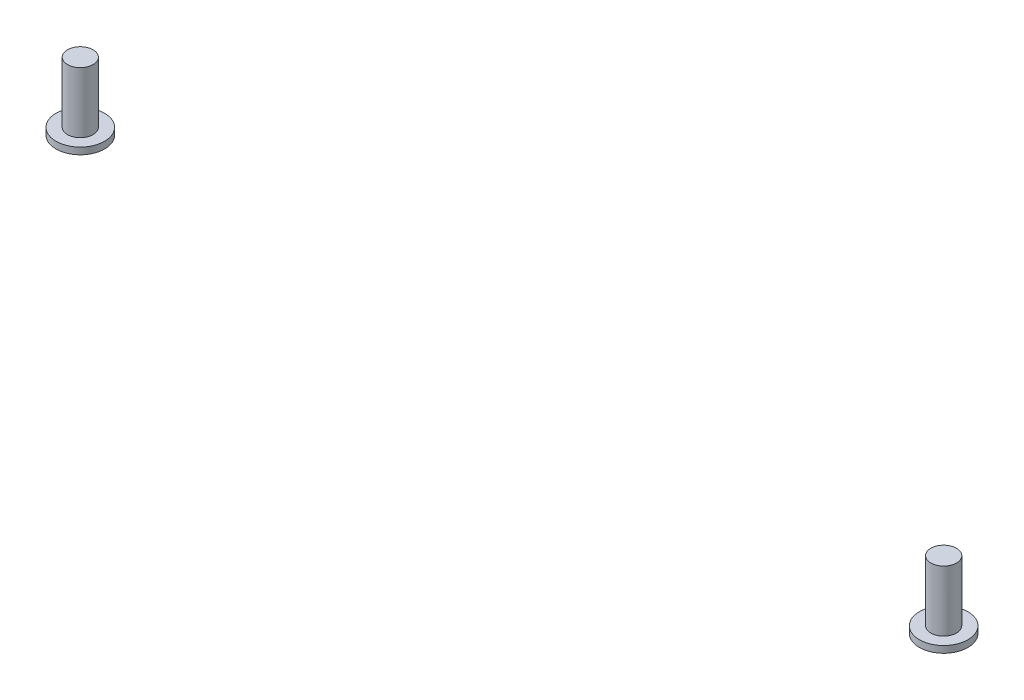
ISO-10303-21;
HEADER;
FILE_DESCRIPTION(('STEP AP214'),'2;1');
FILE_NAME('part.step','',(''),(''),'','','');
FILE_SCHEMA(('AUTOMOTIVE_DESIGN { 1 0 10303 214 1 1 1 1 }'));
ENDSEC;
DATA;
#1=APPLICATION_CONTEXT('core data for automotive mechanical design processes');
#2=APPLICATION_PROTOCOL_DEFINITION('international standard','automotive_design',2000,#1);
#3=PRODUCT_CONTEXT('',#1,'mechanical');
#4=PRODUCT('Part','Part','',(#3));
#5=PRODUCT_RELATED_PRODUCT_CATEGORY('part','',(#4));
#6=PRODUCT_DEFINITION_FORMATION('','',#4);
#7=PRODUCT_DEFINITION_CONTEXT('part definition',#1,'design');
#8=PRODUCT_DEFINITION('design','',#6,#7);
#9=PRODUCT_DEFINITION_SHAPE('','',#8);
#10=(LENGTH_UNIT() NAMED_UNIT(*) SI_UNIT(.MILLI.,.METRE.));
#11=(NAMED_UNIT(*) PLANE_ANGLE_UNIT() SI_UNIT($,.RADIAN.));
#12=(NAMED_UNIT(*) SI_UNIT($,.STERADIAN.) SOLID_ANGLE_UNIT());
#13=UNCERTAINTY_MEASURE_WITH_UNIT(LENGTH_MEASURE(1.E-05),#10,'distance_accuracy_value','');
#14=(GEOMETRIC_REPRESENTATION_CONTEXT(3) GLOBAL_UNCERTAINTY_ASSIGNED_CONTEXT((#13)) GLOBAL_UNIT_ASSIGNED_CONTEXT((#10,
#11,#12)) REPRESENTATION_CONTEXT('',''));
#15=CARTESIAN_POINT('',(0.,0.,0.));
#16=DIRECTION('',(0.,0.,1.));
#17=DIRECTION('',(1.,0.,0.));
#18=AXIS2_PLACEMENT_3D('',#15,#16,#17);
#19=CARTESIAN_POINT('',(-60.,213.,45.));
#20=DIRECTION('',(0.,1.,0.));
#21=DIRECTION('',(0.,0.,1.));
#22=AXIS2_PLACEMENT_3D('',#19,#20,#21);
#23=PLANE('',#22);
#24=CARTESIAN_POINT('',(-60.,213.,45.));
#25=DIRECTION('',(0.,-1.,0.));
#26=DIRECTION('',(0.,0.,-1.));
#27=AXIS2_PLACEMENT_3D('',#24,#25,#26);
#28=CIRCLE('',#27,1.9);
#29=CARTESIAN_POINT('',(-60.,213.,43.1));
#30=VERTEX_POINT('',#29);
#31=EDGE_CURVE('P0_E23',#30,#30,#28,.T.);
#32=ORIENTED_EDGE('',*,*,#31,.F.);
#33=EDGE_LOOP('',(#32));
#34=FACE_BOUND('',#33,.T.);
#35=ADVANCED_FACE('P0_F15',(#34),#23,.T.);
#36=CARTESIAN_POINT('',(-60.,203.95,45.));
#37=DIRECTION('',(0.,1.,0.));
#38=DIRECTION('',(0.,0.,1.));
#39=AXIS2_PLACEMENT_3D('',#36,#37,#38);
#40=CYLINDRICAL_SURFACE('',#39,1.9);
#41=CARTESIAN_POINT('',(-60.,204.,45.));
#42=DIRECTION('',(0.,1.,0.));
#43=DIRECTION('',(0.,0.,1.));
#44=AXIS2_PLACEMENT_3D('',#41,#42,#43);
#45=CIRCLE('',#44,1.9);
#46=CARTESIAN_POINT('',(-60.,204.,46.9));
#47=VERTEX_POINT('',#46);
#48=EDGE_CURVE('P0_E10',#47,#47,#45,.F.);
#49=ORIENTED_EDGE('',*,*,#48,.F.);
#50=EDGE_LOOP('',(#49));
#51=FACE_BOUND('',#50,.T.);
#52=ORIENTED_EDGE('',*,*,#31,.T.);
#53=EDGE_LOOP('',(#52));
#54=FACE_BOUND('',#53,.T.);
#55=ADVANCED_FACE('P0_F17',(#51,#54),#40,.T.);
#56=CARTESIAN_POINT('',(-60.,204.,45.));
#57=DIRECTION('',(0.,1.,0.));
#58=DIRECTION('',(0.,0.,1.));
#59=AXIS2_PLACEMENT_3D('',#56,#57,#58);
#60=PLANE('',#59);
#61=ORIENTED_EDGE('',*,*,#48,.T.);
#62=EDGE_LOOP('',(#61));
#63=FACE_BOUND('',#62,.T.);
#64=CARTESIAN_POINT('',(-60.,204.,45.));
#65=DIRECTION('',(0.,-1.,0.));
#66=DIRECTION('',(0.,0.,-1.));
#67=AXIS2_PLACEMENT_3D('',#64,#65,#66);
#68=CIRCLE('',#67,3.6);
#69=CARTESIAN_POINT('',(-60.,204.,41.4));
#70=VERTEX_POINT('',#69);
#71=EDGE_CURVE('P0_E31',#70,#70,#68,.T.);
#72=ORIENTED_EDGE('',*,*,#71,.F.);
#73=EDGE_LOOP('',(#72));
#74=FACE_BOUND('',#73,.T.);
#75=ADVANCED_FACE('P0_F45',(#63,#74),#60,.T.);
#76=CARTESIAN_POINT('',(-60.,203.,45.));
#77=DIRECTION('',(0.,-1.,0.));
#78=DIRECTION('',(0.,0.,-1.));
#79=AXIS2_PLACEMENT_3D('',#76,#77,#78);
#80=PLANE('',#79);
#81=CARTESIAN_POINT('',(-60.,203.,45.));
#82=DIRECTION('',(0.,1.,0.));
#83=DIRECTION('',(0.,0.,1.));
#84=AXIS2_PLACEMENT_3D('',#81,#82,#83);
#85=CIRCLE('',#84,3.6);
#86=CARTESIAN_POINT('',(-60.,203.,48.6));
#87=VERTEX_POINT('',#86);
#88=EDGE_CURVE('P0_E35',#87,#87,#85,.T.);
#89=ORIENTED_EDGE('',*,*,#88,.F.);
#90=EDGE_LOOP('',(#89));
#91=FACE_BOUND('',#90,.T.);
#92=ADVANCED_FACE('P0_F43',(#91),#80,.T.);
#93=CARTESIAN_POINT('',(-60.,203.,45.));
#94=DIRECTION('',(0.,1.,0.));
#95=DIRECTION('',(0.,0.,1.));
#96=AXIS2_PLACEMENT_3D('',#93,#94,#95);
#97=CYLINDRICAL_SURFACE('',#96,3.6);
#98=ORIENTED_EDGE('',*,*,#71,.T.);
#99=EDGE_LOOP('',(#98));
#100=FACE_BOUND('',#99,.T.);
#101=ORIENTED_EDGE('',*,*,#88,.T.);
#102=EDGE_LOOP('',(#101));
#103=FACE_BOUND('',#102,.T.);
#104=ADVANCED_FACE('P0_F41',(#100,#103),#97,.T.);
#105=CLOSED_SHELL('',(#35,#55,#75,#92,#104));
#106=MANIFOLD_SOLID_BREP('P0_B1',#105);
#107=CARTESIAN_POINT('',(68.,213.,45.));
#108=DIRECTION('',(0.,1.,0.));
#109=DIRECTION('',(0.,0.,1.));
#110=AXIS2_PLACEMENT_3D('',#107,#108,#109);
#111=PLANE('',#110);
#112=CARTESIAN_POINT('',(68.,213.,45.));
#113=DIRECTION('',(0.,-1.,0.));
#114=DIRECTION('',(0.,0.,-1.));
#115=AXIS2_PLACEMENT_3D('',#112,#113,#114);
#116=CIRCLE('',#115,1.9);
#117=CARTESIAN_POINT('',(68.,213.,43.1));
#118=VERTEX_POINT('',#117);
#119=EDGE_CURVE('P1_E23',#118,#118,#116,.T.);
#120=ORIENTED_EDGE('',*,*,#119,.F.);
#121=EDGE_LOOP('',(#120));
#122=FACE_BOUND('',#121,.T.);
#123=ADVANCED_FACE('P1_F15',(#122),#111,.T.);
#124=CARTESIAN_POINT('',(68.,203.95,45.));
#125=DIRECTION('',(0.,1.,0.));
#126=DIRECTION('',(0.,0.,1.));
#127=AXIS2_PLACEMENT_3D('',#124,#125,#126);
#128=CYLINDRICAL_SURFACE('',#127,1.9);
#129=CARTESIAN_POINT('',(68.,204.,45.));
#130=DIRECTION('',(0.,1.,0.));
#131=DIRECTION('',(0.,0.,1.));
#132=AXIS2_PLACEMENT_3D('',#129,#130,#131);
#133=CIRCLE('',#132,1.9);
#134=CARTESIAN_POINT('',(68.,204.,46.9));
#135=VERTEX_POINT('',#134);
#136=EDGE_CURVE('P1_E10',#135,#135,#133,.F.);
#137=ORIENTED_EDGE('',*,*,#136,.F.);
#138=EDGE_LOOP('',(#137));
#139=FACE_BOUND('',#138,.T.);
#140=ORIENTED_EDGE('',*,*,#119,.T.);
#141=EDGE_LOOP('',(#140));
#142=FACE_BOUND('',#141,.T.);
#143=ADVANCED_FACE('P1_F17',(#139,#142),#128,.T.);
#144=CARTESIAN_POINT('',(68.,204.,45.));
#145=DIRECTION('',(0.,1.,0.));
#146=DIRECTION('',(0.,0.,1.));
#147=AXIS2_PLACEMENT_3D('',#144,#145,#146);
#148=PLANE('',#147);
#149=ORIENTED_EDGE('',*,*,#136,.T.);
#150=EDGE_LOOP('',(#149));
#151=FACE_BOUND('',#150,.T.);
#152=CARTESIAN_POINT('',(68.,204.,45.));
#153=DIRECTION('',(0.,-1.,0.));
#154=DIRECTION('',(0.,0.,-1.));
#155=AXIS2_PLACEMENT_3D('',#152,#153,#154);
#156=CIRCLE('',#155,3.6);
#157=CARTESIAN_POINT('',(68.,204.,41.4));
#158=VERTEX_POINT('',#157);
#159=EDGE_CURVE('P1_E30',#158,#158,#156,.T.);
#160=ORIENTED_EDGE('',*,*,#159,.F.);
#161=EDGE_LOOP('',(#160));
#162=FACE_BOUND('',#161,.T.);
#163=ADVANCED_FACE('P1_F45',(#151,#162),#148,.T.);
#164=CARTESIAN_POINT('',(68.,203.,45.));
#165=DIRECTION('',(0.,-1.,0.));
#166=DIRECTION('',(0.,0.,-1.));
#167=AXIS2_PLACEMENT_3D('',#164,#165,#166);
#168=PLANE('',#167);
#169=CARTESIAN_POINT('',(68.,203.,45.));
#170=DIRECTION('',(0.,1.,0.));
#171=DIRECTION('',(0.,0.,1.));
#172=AXIS2_PLACEMENT_3D('',#169,#170,#171);
#173=CIRCLE('',#172,3.6);
#174=CARTESIAN_POINT('',(68.,203.,48.6));
#175=VERTEX_POINT('',#174);
#176=EDGE_CURVE('P1_E35',#175,#175,#173,.T.);
#177=ORIENTED_EDGE('',*,*,#176,.F.);
#178=EDGE_LOOP('',(#177));
#179=FACE_BOUND('',#178,.T.);
#180=ADVANCED_FACE('P1_F43',(#179),#168,.T.);
#181=CARTESIAN_POINT('',(68.,203.,45.));
#182=DIRECTION('',(0.,1.,0.));
#183=DIRECTION('',(0.,0.,1.));
#184=AXIS2_PLACEMENT_3D('',#181,#182,#183);
#185=CYLINDRICAL_SURFACE('',#184,3.6);
#186=ORIENTED_EDGE('',*,*,#159,.T.);
#187=EDGE_LOOP('',(#186));
#188=FACE_BOUND('',#187,.T.);
#189=ORIENTED_EDGE('',*,*,#176,.T.);
#190=EDGE_LOOP('',(#189));
#191=FACE_BOUND('',#190,.T.);
#192=ADVANCED_FACE('P1_F41',(#188,#191),#185,.T.);
#193=CLOSED_SHELL('',(#123,#143,#163,#180,#192));
#194=MANIFOLD_SOLID_BREP('P1_B1',#193);
#195=ADVANCED_BREP_SHAPE_REPRESENTATION('',(#18,#106,#194),#14);
#196=SHAPE_DEFINITION_REPRESENTATION(#9,#195);
ENDSEC;
END-ISO-10303-21;
